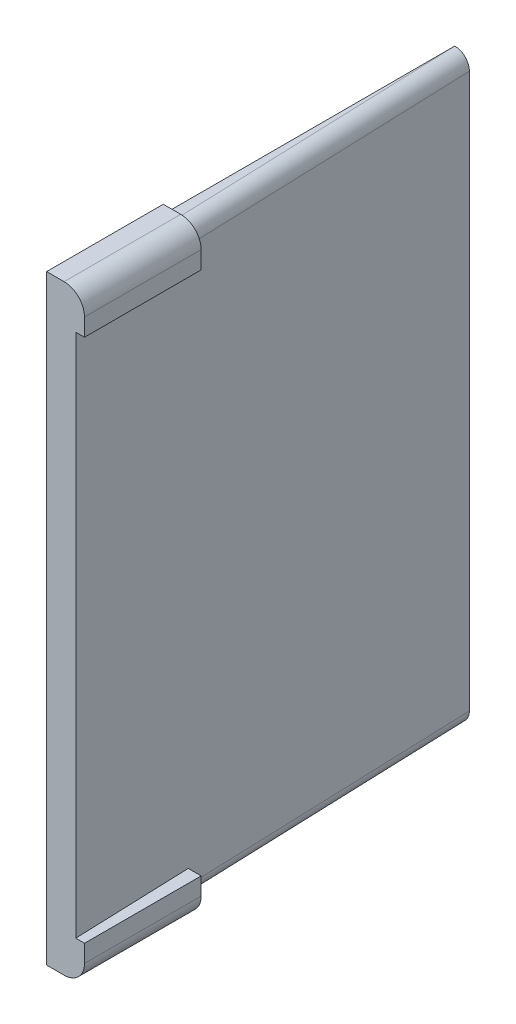
ISO-10303-21;
HEADER;
FILE_DESCRIPTION(('STEP AP214'),'2;1');
FILE_NAME('part.step','',(''),(''),'','','');
FILE_SCHEMA(('AUTOMOTIVE_DESIGN { 1 0 10303 214 1 1 1 1 }'));
ENDSEC;
DATA;
#1=APPLICATION_CONTEXT('core data for automotive mechanical design processes');
#2=APPLICATION_PROTOCOL_DEFINITION('international standard','automotive_design',2000,#1);
#3=PRODUCT_CONTEXT('',#1,'mechanical');
#4=PRODUCT('Part','Part','',(#3));
#5=PRODUCT_RELATED_PRODUCT_CATEGORY('part','',(#4));
#6=PRODUCT_DEFINITION_FORMATION('','',#4);
#7=PRODUCT_DEFINITION_CONTEXT('part definition',#1,'design');
#8=PRODUCT_DEFINITION('design','',#6,#7);
#9=PRODUCT_DEFINITION_SHAPE('','',#8);
#10=(LENGTH_UNIT() NAMED_UNIT(*) SI_UNIT(.MILLI.,.METRE.));
#11=(NAMED_UNIT(*) PLANE_ANGLE_UNIT() SI_UNIT($,.RADIAN.));
#12=(NAMED_UNIT(*) SI_UNIT($,.STERADIAN.) SOLID_ANGLE_UNIT());
#13=UNCERTAINTY_MEASURE_WITH_UNIT(LENGTH_MEASURE(1.E-05),#10,'distance_accuracy_value','');
#14=(GEOMETRIC_REPRESENTATION_CONTEXT(3) GLOBAL_UNCERTAINTY_ASSIGNED_CONTEXT((#13)) GLOBAL_UNIT_ASSIGNED_CONTEXT((#10,
#11,#12)) REPRESENTATION_CONTEXT('',''));
#15=CARTESIAN_POINT('',(0.,0.,0.));
#16=DIRECTION('',(0.,0.,1.));
#17=DIRECTION('',(1.,0.,0.));
#18=AXIS2_PLACEMENT_3D('',#15,#16,#17);
#19=CARTESIAN_POINT('',(0.,200.,0.));
#20=DIRECTION('',(1.,0.,0.));
#21=DIRECTION('',(0.,0.,-1.));
#22=AXIS2_PLACEMENT_3D('',#19,#20,#21);
#23=PLANE('',#22);
#24=DIRECTION('',(0.,0.,1.));
#25=VECTOR('',#24,1.);
#26=CARTESIAN_POINT('',(0.,0.,0.));
#27=LINE('',#26,#25);
#28=CARTESIAN_POINT('',(0.,0.,-140.));
#29=VERTEX_POINT('',#28);
#30=CARTESIAN_POINT('',(0.,0.,-139.910742738781));
#31=VERTEX_POINT('',#30);
#32=EDGE_CURVE('E250',#29,#31,#27,.T.);
#33=ORIENTED_EDGE('',*,*,#32,.T.);
#34=CARTESIAN_POINT('',(0.,0.,-40.));
#35=VERTEX_POINT('',#34);
#36=EDGE_CURVE('E244',#31,#35,#27,.T.);
#37=ORIENTED_EDGE('',*,*,#36,.T.);
#38=DIRECTION('',(0.,-1.,0.));
#39=VECTOR('',#38,1.);
#40=CARTESIAN_POINT('',(0.,9.99999999999999,-40.));
#41=LINE('',#40,#39);
#42=CARTESIAN_POINT('',(0.,-2.99999999999999,-40.));
#43=VERTEX_POINT('',#42);
#44=EDGE_CURVE('E189',#35,#43,#41,.T.);
#45=ORIENTED_EDGE('',*,*,#44,.T.);
#46=DIRECTION('',(0.,0.,1.));
#47=VECTOR('',#46,1.);
#48=CARTESIAN_POINT('',(0.,-2.99999999999998,0.));
#49=LINE('',#48,#47);
#50=CARTESIAN_POINT('',(0.,-2.99999999999998,0.));
#51=VERTEX_POINT('',#50);
#52=EDGE_CURVE('E169',#43,#51,#49,.T.);
#53=ORIENTED_EDGE('',*,*,#52,.T.);
#54=DIRECTION('',(0.,-1.,0.));
#55=VECTOR('',#54,1.);
#56=CARTESIAN_POINT('',(0.,200.,0.));
#57=LINE('',#56,#55);
#58=CARTESIAN_POINT('',(0.,203.,0.));
#59=VERTEX_POINT('',#58);
#60=EDGE_CURVE('E264',#59,#51,#57,.T.);
#61=ORIENTED_EDGE('',*,*,#60,.F.);
#62=DIRECTION('',(0.,0.,-1.));
#63=VECTOR('',#62,1.);
#64=CARTESIAN_POINT('',(0.,203.,0.));
#65=LINE('',#64,#63);
#66=CARTESIAN_POINT('',(0.,203.,-40.));
#67=VERTEX_POINT('',#66);
#68=EDGE_CURVE('E208',#59,#67,#65,.T.);
#69=ORIENTED_EDGE('',*,*,#68,.T.);
#70=DIRECTION('',(0.,-1.,0.));
#71=VECTOR('',#70,1.);
#72=CARTESIAN_POINT('',(0.,190.,-40.));
#73=LINE('',#72,#71);
#74=CARTESIAN_POINT('',(0.,200.,-40.));
#75=VERTEX_POINT('',#74);
#76=EDGE_CURVE('E214',#67,#75,#73,.T.);
#77=ORIENTED_EDGE('',*,*,#76,.T.);
#78=DIRECTION('',(0.,0.,1.));
#79=VECTOR('',#78,1.);
#80=CARTESIAN_POINT('',(0.,200.,0.));
#81=LINE('',#80,#79);
#82=CARTESIAN_POINT('',(0.,200.,-139.910742738781));
#83=VERTEX_POINT('',#82);
#84=EDGE_CURVE('E249',#83,#75,#81,.T.);
#85=ORIENTED_EDGE('',*,*,#84,.F.);
#86=CARTESIAN_POINT('',(0.,200.,-140.));
#87=VERTEX_POINT('',#86);
#88=EDGE_CURVE('E245',#87,#83,#81,.T.);
#89=ORIENTED_EDGE('',*,*,#88,.F.);
#90=DIRECTION('',(0.,-1.,0.));
#91=VECTOR('',#90,1.);
#92=CARTESIAN_POINT('',(0.,200.,-140.));
#93=LINE('',#92,#91);
#94=EDGE_CURVE('E248',#87,#29,#93,.T.);
#95=ORIENTED_EDGE('',*,*,#94,.T.);
#96=EDGE_LOOP('',(#33,#37,#45,#53,#61,#69,#77,#85,#89,#95));
#97=FACE_BOUND('',#96,.T.);
#98=ADVANCED_FACE('F41',(#97),#23,.F.);
#99=CARTESIAN_POINT('',(10.,200.,0.));
#100=DIRECTION('',(0.,0.,-1.));
#101=DIRECTION('',(-1.,0.,0.));
#102=AXIS2_PLACEMENT_3D('',#99,#100,#101);
#103=PLANE('',#102);
#104=DIRECTION('',(-1.,0.,0.));
#105=VECTOR('',#104,1.);
#106=CARTESIAN_POINT('',(13.,-2.99999999999998,0.));
#107=LINE('',#106,#105);
#108=CARTESIAN_POINT('',(6.,-2.99999999999998,0.));
#109=VERTEX_POINT('',#108);
#110=EDGE_CURVE('E196',#109,#51,#107,.T.);
#111=ORIENTED_EDGE('',*,*,#110,.F.);
#112=CARTESIAN_POINT('',(6.,4.00000000000002,0.));
#113=DIRECTION('',(0.,0.,-1.));
#114=DIRECTION('',(-1.,0.,0.));
#115=AXIS2_PLACEMENT_3D('',#112,#113,#114);
#116=CIRCLE('',#115,7.);
#117=CARTESIAN_POINT('',(13.,4.00000000000002,0.));
#118=VERTEX_POINT('',#117);
#119=EDGE_CURVE('E163',#109,#118,#116,.F.);
#120=ORIENTED_EDGE('',*,*,#119,.T.);
#121=DIRECTION('',(0.,1.,0.));
#122=VECTOR('',#121,1.);
#123=CARTESIAN_POINT('',(13.,10.,0.));
#124=LINE('',#123,#122);
#125=CARTESIAN_POINT('',(13.,10.,0.));
#126=VERTEX_POINT('',#125);
#127=EDGE_CURVE('E156',#118,#126,#124,.T.);
#128=ORIENTED_EDGE('',*,*,#127,.T.);
#129=DIRECTION('',(-1.,0.,0.));
#130=VECTOR('',#129,1.);
#131=CARTESIAN_POINT('',(13.,10.,0.));
#132=LINE('',#131,#130);
#133=CARTESIAN_POINT('',(10.,9.99999999999999,0.));
#134=VERTEX_POINT('',#133);
#135=EDGE_CURVE('E161',#126,#134,#132,.T.);
#136=ORIENTED_EDGE('',*,*,#135,.T.);
#137=DIRECTION('',(0.,-1.,0.));
#138=VECTOR('',#137,1.);
#139=CARTESIAN_POINT('',(10.,200.,0.));
#140=LINE('',#139,#138);
#141=CARTESIAN_POINT('',(10.,190.,0.));
#142=VERTEX_POINT('',#141);
#143=EDGE_CURVE('E261',#142,#134,#140,.T.);
#144=ORIENTED_EDGE('',*,*,#143,.F.);
#145=DIRECTION('',(-1.,0.,0.));
#146=VECTOR('',#145,1.);
#147=CARTESIAN_POINT('',(13.,190.,0.));
#148=LINE('',#147,#146);
#149=CARTESIAN_POINT('',(13.,190.,0.));
#150=VERTEX_POINT('',#149);
#151=EDGE_CURVE('E228',#150,#142,#148,.T.);
#152=ORIENTED_EDGE('',*,*,#151,.F.);
#153=DIRECTION('',(0.,1.,0.));
#154=VECTOR('',#153,1.);
#155=CARTESIAN_POINT('',(13.,190.,0.));
#156=LINE('',#155,#154);
#157=CARTESIAN_POINT('',(13.,196.,0.));
#158=VERTEX_POINT('',#157);
#159=EDGE_CURVE('E209',#150,#158,#156,.T.);
#160=ORIENTED_EDGE('',*,*,#159,.T.);
#161=CARTESIAN_POINT('',(6.,196.,0.));
#162=DIRECTION('',(0.,0.,-1.));
#163=DIRECTION('',(-1.,0.,0.));
#164=AXIS2_PLACEMENT_3D('',#161,#162,#163);
#165=CIRCLE('',#164,7.);
#166=CARTESIAN_POINT('',(6.,203.,0.));
#167=VERTEX_POINT('',#166);
#168=EDGE_CURVE('E283',#158,#167,#165,.F.);
#169=ORIENTED_EDGE('',*,*,#168,.T.);
#170=DIRECTION('',(-1.,0.,0.));
#171=VECTOR('',#170,1.);
#172=CARTESIAN_POINT('',(13.,203.,0.));
#173=LINE('',#172,#171);
#174=EDGE_CURVE('E221',#167,#59,#173,.T.);
#175=ORIENTED_EDGE('',*,*,#174,.T.);
#176=ORIENTED_EDGE('',*,*,#60,.T.);
#177=EDGE_LOOP('',(#111,#120,#128,#136,#144,#152,#160,#169,#175,#176));
#178=FACE_BOUND('',#177,.T.);
#179=ADVANCED_FACE('F159',(#178),#103,.F.);
#180=CARTESIAN_POINT('',(5.,200.,-140.));
#181=DIRECTION('',(-0.99936285434755,0.,0.0356915305124125));
#182=DIRECTION('',(0.0356915305124125,0.,0.99936285434755));
#183=AXIS2_PLACEMENT_3D('',#180,#181,#182);
#184=PLANE('',#183);
#185=DIRECTION('',(0.,-1.,0.));
#186=VECTOR('',#185,1.);
#187=CARTESIAN_POINT('',(8.57142857142857,200.,-40.));
#188=LINE('',#187,#186);
#189=CARTESIAN_POINT('',(8.57142857142857,9.99999999999998,-40.));
#190=VERTEX_POINT('',#189);
#191=CARTESIAN_POINT('',(8.57142857142857,5.00000000000006,-40.));
#192=VERTEX_POINT('',#191);
#193=EDGE_CURVE('E199',#190,#192,#188,.T.);
#194=ORIENTED_EDGE('',*,*,#193,.T.);
#195=DIRECTION('',(-0.0356915305124125,0.,-0.99936285434755));
#196=VECTOR('',#195,1.);
#197=CARTESIAN_POINT('',(5.,5.,-140.));
#198=LINE('',#197,#196);
#199=CARTESIAN_POINT('',(5.,5.,-140.));
#200=VERTEX_POINT('',#199);
#201=EDGE_CURVE('E307',#192,#200,#198,.T.);
#202=ORIENTED_EDGE('',*,*,#201,.T.);
#203=DIRECTION('',(0.,-1.,0.));
#204=VECTOR('',#203,1.);
#205=CARTESIAN_POINT('',(5.,200.,-140.));
#206=LINE('',#205,#204);
#207=CARTESIAN_POINT('',(5.,195.,-140.));
#208=VERTEX_POINT('',#207);
#209=EDGE_CURVE('E257',#208,#200,#206,.T.);
#210=ORIENTED_EDGE('',*,*,#209,.F.);
#211=DIRECTION('',(-0.0356915305124125,0.,-0.99936285434755));
#212=VECTOR('',#211,1.);
#213=CARTESIAN_POINT('',(5.,195.,-140.));
#214=LINE('',#213,#212);
#215=CARTESIAN_POINT('',(8.57142857142857,195.,-40.));
#216=VERTEX_POINT('',#215);
#217=EDGE_CURVE('E304',#208,#216,#214,.F.);
#218=ORIENTED_EDGE('',*,*,#217,.T.);
#219=DIRECTION('',(0.,-1.,0.));
#220=VECTOR('',#219,1.);
#221=CARTESIAN_POINT('',(8.57142857142857,200.,-40.));
#222=LINE('',#221,#220);
#223=CARTESIAN_POINT('',(8.57142857142857,190.,-40.));
#224=VERTEX_POINT('',#223);
#225=EDGE_CURVE('E232',#216,#224,#222,.T.);
#226=ORIENTED_EDGE('',*,*,#225,.T.);
#227=DIRECTION('',(0.0356915305124125,0.,0.99936285434755));
#228=VECTOR('',#227,1.);
#229=CARTESIAN_POINT('',(5.,190.,-140.));
#230=LINE('',#229,#228);
#231=EDGE_CURVE('E271',#224,#142,#230,.T.);
#232=ORIENTED_EDGE('',*,*,#231,.T.);
#233=ORIENTED_EDGE('',*,*,#143,.T.);
#234=DIRECTION('',(-0.0356915305124125,0.,-0.99936285434755));
#235=VECTOR('',#234,1.);
#236=CARTESIAN_POINT('',(5.,9.99999999999993,-140.));
#237=LINE('',#236,#235);
#238=EDGE_CURVE('E176',#134,#190,#237,.T.);
#239=ORIENTED_EDGE('',*,*,#238,.T.);
#240=EDGE_LOOP('',(#194,#202,#210,#218,#226,#232,#233,#239));
#241=FACE_BOUND('',#240,.T.);
#242=ADVANCED_FACE('F330',(#241),#184,.F.);
#243=CARTESIAN_POINT('',(0.,200.,-140.));
#244=DIRECTION('',(0.,0.,1.));
#245=DIRECTION('',(1.,0.,0.));
#246=AXIS2_PLACEMENT_3D('',#243,#244,#245);
#247=PLANE('',#246);
#248=ORIENTED_EDGE('',*,*,#209,.T.);
#249=CARTESIAN_POINT('',(-0.00318775932924914,5.,-140.));
#250=DIRECTION('',(0.,0.,1.));
#251=DIRECTION('',(1.,0.,0.));
#252=AXIS2_PLACEMENT_3D('',#249,#250,#251);
#253=ELLIPSE('',#252,5.00318775932925,5.);
#254=EDGE_CURVE('E314',#200,#29,#253,.F.);
#255=ORIENTED_EDGE('',*,*,#254,.T.);
#256=ORIENTED_EDGE('',*,*,#94,.F.);
#257=CARTESIAN_POINT('',(-0.00318775932924877,195.,-140.));
#258=DIRECTION('',(0.,0.,1.));
#259=DIRECTION('',(-1.,0.,0.));
#260=AXIS2_PLACEMENT_3D('',#257,#258,#259);
#261=ELLIPSE('',#260,5.00318775932925,5.);
#262=EDGE_CURVE('E311',#87,#208,#261,.F.);
#263=ORIENTED_EDGE('',*,*,#262,.T.);
#264=EDGE_LOOP('',(#248,#255,#256,#263));
#265=FACE_BOUND('',#264,.T.);
#266=ADVANCED_FACE('F335',(#265),#247,.F.);
#267=CARTESIAN_POINT('',(0.,200.,0.));
#268=DIRECTION('',(0.,-1.,0.));
#269=DIRECTION('',(0.,0.,-1.));
#270=AXIS2_PLACEMENT_3D('',#267,#268,#269);
#271=PLANE('',#270);
#272=DIRECTION('',(1.,0.,0.));
#273=VECTOR('',#272,1.);
#274=CARTESIAN_POINT('',(0.,200.,-40.));
#275=LINE('',#274,#273);
#276=CARTESIAN_POINT('',(3.56824081209932,200.,-40.));
#277=VERTEX_POINT('',#276);
#278=EDGE_CURVE('E268',#75,#277,#275,.T.);
#279=ORIENTED_EDGE('',*,*,#278,.T.);
#280=DIRECTION('',(-0.0356915305124125,0.,-0.99936285434755));
#281=VECTOR('',#280,1.);
#282=CARTESIAN_POINT('',(4.99044687475907,200.,-0.17823024552711));
#283=LINE('',#282,#281);
#284=EDGE_CURVE('E319',#277,#83,#283,.T.);
#285=ORIENTED_EDGE('',*,*,#284,.T.);
#286=ORIENTED_EDGE('',*,*,#84,.T.);
#287=EDGE_LOOP('',(#279,#285,#286));
#288=FACE_BOUND('',#287,.T.);
#289=ADVANCED_FACE('F348',(#288),#271,.F.);
#290=CARTESIAN_POINT('',(0.,0.,0.));
#291=DIRECTION('',(0.,-1.,0.));
#292=DIRECTION('',(0.,0.,-1.));
#293=AXIS2_PLACEMENT_3D('',#290,#291,#292);
#294=PLANE('',#293);
#295=ORIENTED_EDGE('',*,*,#36,.F.);
#296=DIRECTION('',(-0.0356915305124125,0.,-0.99936285434755));
#297=VECTOR('',#296,1.);
#298=CARTESIAN_POINT('',(3.57461429969083,0.,-39.8215423474379));
#299=LINE('',#298,#297);
#300=CARTESIAN_POINT('',(3.56824081209932,0.,-40.));
#301=VERTEX_POINT('',#300);
#302=EDGE_CURVE('E63',#31,#301,#299,.F.);
#303=ORIENTED_EDGE('',*,*,#302,.T.);
#304=DIRECTION('',(1.,0.,0.));
#305=VECTOR('',#304,1.);
#306=CARTESIAN_POINT('',(0.,0.,-40.));
#307=LINE('',#306,#305);
#308=EDGE_CURVE('E274',#35,#301,#307,.T.);
#309=ORIENTED_EDGE('',*,*,#308,.F.);
#310=EDGE_LOOP('',(#295,#303,#309));
#311=FACE_BOUND('',#310,.T.);
#312=ADVANCED_FACE('F368',(#311),#294,.T.);
#313=CARTESIAN_POINT('',(13.,190.,0.));
#314=DIRECTION('',(0.,-1.,0.));
#315=DIRECTION('',(0.,0.,-1.));
#316=AXIS2_PLACEMENT_3D('',#313,#314,#315);
#317=PLANE('',#316);
#318=ORIENTED_EDGE('',*,*,#231,.F.);
#319=DIRECTION('',(-1.,0.,0.));
#320=VECTOR('',#319,1.);
#321=CARTESIAN_POINT('',(13.,190.,-40.));
#322=LINE('',#321,#320);
#323=CARTESIAN_POINT('',(13.,190.,-40.));
#324=VERTEX_POINT('',#323);
#325=EDGE_CURVE('E233',#324,#224,#322,.T.);
#326=ORIENTED_EDGE('',*,*,#325,.F.);
#327=DIRECTION('',(0.,0.,1.));
#328=VECTOR('',#327,1.);
#329=CARTESIAN_POINT('',(13.,190.,0.));
#330=LINE('',#329,#328);
#331=EDGE_CURVE('E217',#324,#150,#330,.T.);
#332=ORIENTED_EDGE('',*,*,#331,.T.);
#333=ORIENTED_EDGE('',*,*,#151,.T.);
#334=EDGE_LOOP('',(#318,#326,#332,#333));
#335=FACE_BOUND('',#334,.T.);
#336=ADVANCED_FACE('F366',(#335),#317,.T.);
#337=CARTESIAN_POINT('',(13.,190.,-40.));
#338=DIRECTION('',(0.,0.,-1.));
#339=DIRECTION('',(-1.,0.,0.));
#340=AXIS2_PLACEMENT_3D('',#337,#338,#339);
#341=PLANE('',#340);
#342=DIRECTION('',(-1.,0.,0.));
#343=VECTOR('',#342,1.);
#344=CARTESIAN_POINT('',(13.,203.,-40.));
#345=LINE('',#344,#343);
#346=CARTESIAN_POINT('',(6.,203.,-40.));
#347=VERTEX_POINT('',#346);
#348=EDGE_CURVE('E237',#347,#67,#345,.T.);
#349=ORIENTED_EDGE('',*,*,#348,.F.);
#350=CARTESIAN_POINT('',(6.,196.,-40.));
#351=DIRECTION('',(0.,0.,-1.));
#352=DIRECTION('',(-1.,0.,0.));
#353=AXIS2_PLACEMENT_3D('',#350,#351,#352);
#354=CIRCLE('',#353,7.);
#355=CARTESIAN_POINT('',(13.,196.,-40.));
#356=VERTEX_POINT('',#355);
#357=EDGE_CURVE('E298',#347,#356,#354,.T.);
#358=ORIENTED_EDGE('',*,*,#357,.T.);
#359=DIRECTION('',(0.,-1.,0.));
#360=VECTOR('',#359,1.);
#361=CARTESIAN_POINT('',(13.,190.,-40.));
#362=LINE('',#361,#360);
#363=EDGE_CURVE('E213',#356,#324,#362,.T.);
#364=ORIENTED_EDGE('',*,*,#363,.T.);
#365=ORIENTED_EDGE('',*,*,#325,.T.);
#366=ORIENTED_EDGE('',*,*,#225,.F.);
#367=CARTESIAN_POINT('',(3.56824081209932,195.,-40.));
#368=DIRECTION('',(0.,0.,-1.));
#369=DIRECTION('',(-1.,0.,0.));
#370=AXIS2_PLACEMENT_3D('',#367,#368,#369);
#371=ELLIPSE('',#370,5.00318775932925,5.);
#372=EDGE_CURVE('E11',#216,#277,#371,.F.);
#373=ORIENTED_EDGE('',*,*,#372,.T.);
#374=ORIENTED_EDGE('',*,*,#278,.F.);
#375=ORIENTED_EDGE('',*,*,#76,.F.);
#376=EDGE_LOOP('',(#349,#358,#364,#365,#366,#373,#374,#375));
#377=FACE_BOUND('',#376,.T.);
#378=ADVANCED_FACE('F345',(#377),#341,.T.);
#379=CARTESIAN_POINT('',(13.,203.,0.));
#380=DIRECTION('',(0.,1.,0.));
#381=DIRECTION('',(0.,0.,1.));
#382=AXIS2_PLACEMENT_3D('',#379,#380,#381);
#383=PLANE('',#382);
#384=ORIENTED_EDGE('',*,*,#174,.F.);
#385=DIRECTION('',(0.,0.,-1.));
#386=VECTOR('',#385,1.);
#387=CARTESIAN_POINT('',(6.,203.,-40.));
#388=LINE('',#387,#386);
#389=EDGE_CURVE('E294',#167,#347,#388,.T.);
#390=ORIENTED_EDGE('',*,*,#389,.T.);
#391=ORIENTED_EDGE('',*,*,#348,.T.);
#392=ORIENTED_EDGE('',*,*,#68,.F.);
#393=EDGE_LOOP('',(#384,#390,#391,#392));
#394=FACE_BOUND('',#393,.T.);
#395=ADVANCED_FACE('F354',(#394),#383,.T.);
#396=CARTESIAN_POINT('',(13.,0.,0.));
#397=DIRECTION('',(-1.,0.,0.));
#398=DIRECTION('',(0.,0.,1.));
#399=AXIS2_PLACEMENT_3D('',#396,#397,#398);
#400=PLANE('',#399);
#401=ORIENTED_EDGE('',*,*,#363,.F.);
#402=DIRECTION('',(0.,0.,-1.));
#403=VECTOR('',#402,1.);
#404=CARTESIAN_POINT('',(13.,196.,0.));
#405=LINE('',#404,#403);
#406=EDGE_CURVE('E301',#356,#158,#405,.F.);
#407=ORIENTED_EDGE('',*,*,#406,.T.);
#408=ORIENTED_EDGE('',*,*,#159,.F.);
#409=ORIENTED_EDGE('',*,*,#331,.F.);
#410=EDGE_LOOP('',(#401,#407,#408,#409));
#411=FACE_BOUND('',#410,.T.);
#412=ADVANCED_FACE('F361',(#411),#400,.F.);
#413=CARTESIAN_POINT('',(13.,10.,0.));
#414=DIRECTION('',(0.,1.,0.));
#415=DIRECTION('',(0.,0.,1.));
#416=AXIS2_PLACEMENT_3D('',#413,#414,#415);
#417=PLANE('',#416);
#418=ORIENTED_EDGE('',*,*,#238,.F.);
#419=ORIENTED_EDGE('',*,*,#135,.F.);
#420=DIRECTION('',(0.,0.,-1.));
#421=VECTOR('',#420,1.);
#422=CARTESIAN_POINT('',(13.,10.,0.));
#423=LINE('',#422,#421);
#424=CARTESIAN_POINT('',(13.,9.99999999999999,-40.));
#425=VERTEX_POINT('',#424);
#426=EDGE_CURVE('E168',#126,#425,#423,.T.);
#427=ORIENTED_EDGE('',*,*,#426,.T.);
#428=DIRECTION('',(-1.,0.,0.));
#429=VECTOR('',#428,1.);
#430=CARTESIAN_POINT('',(13.,9.99999999999999,-40.));
#431=LINE('',#430,#429);
#432=EDGE_CURVE('E178',#425,#190,#431,.T.);
#433=ORIENTED_EDGE('',*,*,#432,.T.);
#434=EDGE_LOOP('',(#418,#419,#427,#433));
#435=FACE_BOUND('',#434,.T.);
#436=ADVANCED_FACE('F173',(#435),#417,.T.);
#437=CARTESIAN_POINT('',(13.,9.99999999999999,-40.));
#438=DIRECTION('',(0.,0.,-1.));
#439=DIRECTION('',(-1.,0.,0.));
#440=AXIS2_PLACEMENT_3D('',#437,#438,#439);
#441=PLANE('',#440);
#442=DIRECTION('',(0.,-1.,0.));
#443=VECTOR('',#442,1.);
#444=CARTESIAN_POINT('',(13.,9.99999999999999,-40.));
#445=LINE('',#444,#443);
#446=CARTESIAN_POINT('',(13.,4.00000000000001,-40.));
#447=VERTEX_POINT('',#446);
#448=EDGE_CURVE('E179',#425,#447,#445,.T.);
#449=ORIENTED_EDGE('',*,*,#448,.T.);
#450=CARTESIAN_POINT('',(6.,4.00000000000001,-40.));
#451=DIRECTION('',(0.,0.,-1.));
#452=DIRECTION('',(-1.,0.,0.));
#453=AXIS2_PLACEMENT_3D('',#450,#451,#452);
#454=CIRCLE('',#453,7.);
#455=CARTESIAN_POINT('',(6.,-2.99999999999999,-40.));
#456=VERTEX_POINT('',#455);
#457=EDGE_CURVE('E291',#447,#456,#454,.T.);
#458=ORIENTED_EDGE('',*,*,#457,.T.);
#459=DIRECTION('',(-1.,0.,0.));
#460=VECTOR('',#459,1.);
#461=CARTESIAN_POINT('',(13.,-2.99999999999999,-40.));
#462=LINE('',#461,#460);
#463=EDGE_CURVE('E200',#456,#43,#462,.T.);
#464=ORIENTED_EDGE('',*,*,#463,.T.);
#465=ORIENTED_EDGE('',*,*,#44,.F.);
#466=ORIENTED_EDGE('',*,*,#308,.T.);
#467=CARTESIAN_POINT('',(3.56824081209932,5.,-40.));
#468=DIRECTION('',(0.,0.,-1.));
#469=DIRECTION('',(1.,0.,0.));
#470=AXIS2_PLACEMENT_3D('',#467,#468,#469);
#471=ELLIPSE('',#470,5.00318775932925,5.);
#472=EDGE_CURVE('E50',#301,#192,#471,.F.);
#473=ORIENTED_EDGE('',*,*,#472,.T.);
#474=ORIENTED_EDGE('',*,*,#193,.F.);
#475=ORIENTED_EDGE('',*,*,#432,.F.);
#476=EDGE_LOOP('',(#449,#458,#464,#465,#466,#473,#474,#475));
#477=FACE_BOUND('',#476,.T.);
#478=ADVANCED_FACE('F325',(#477),#441,.T.);
#479=CARTESIAN_POINT('',(13.,-2.99999999999998,0.));
#480=DIRECTION('',(0.,-1.,0.));
#481=DIRECTION('',(0.,0.,-1.));
#482=AXIS2_PLACEMENT_3D('',#479,#480,#481);
#483=PLANE('',#482);
#484=ORIENTED_EDGE('',*,*,#463,.F.);
#485=DIRECTION('',(0.,0.,1.));
#486=VECTOR('',#485,1.);
#487=CARTESIAN_POINT('',(6.,-2.99999999999998,0.));
#488=LINE('',#487,#486);
#489=EDGE_CURVE('E279',#456,#109,#488,.T.);
#490=ORIENTED_EDGE('',*,*,#489,.T.);
#491=ORIENTED_EDGE('',*,*,#110,.T.);
#492=ORIENTED_EDGE('',*,*,#52,.F.);
#493=EDGE_LOOP('',(#484,#490,#491,#492));
#494=FACE_BOUND('',#493,.T.);
#495=ADVANCED_FACE('F411',(#494),#483,.T.);
#496=CARTESIAN_POINT('',(13.,0.,0.));
#497=DIRECTION('',(1.,0.,0.));
#498=DIRECTION('',(0.,0.,-1.));
#499=AXIS2_PLACEMENT_3D('',#496,#497,#498);
#500=PLANE('',#499);
#501=ORIENTED_EDGE('',*,*,#127,.F.);
#502=DIRECTION('',(0.,0.,1.));
#503=VECTOR('',#502,1.);
#504=CARTESIAN_POINT('',(13.,4.00000000000002,0.));
#505=LINE('',#504,#503);
#506=EDGE_CURVE('E288',#118,#447,#505,.F.);
#507=ORIENTED_EDGE('',*,*,#506,.T.);
#508=ORIENTED_EDGE('',*,*,#448,.F.);
#509=ORIENTED_EDGE('',*,*,#426,.F.);
#510=EDGE_LOOP('',(#501,#507,#508,#509));
#511=FACE_BOUND('',#510,.T.);
#512=ADVANCED_FACE('F182',(#511),#500,.T.);
#513=CARTESIAN_POINT('',(6.,4.00000000000002,0.));
#514=DIRECTION('',(0.,0.,1.));
#515=DIRECTION('',(0.,-1.,0.));
#516=AXIS2_PLACEMENT_3D('',#513,#514,#515);
#517=CYLINDRICAL_SURFACE('',#516,7.);
#518=ORIENTED_EDGE('',*,*,#457,.F.);
#519=ORIENTED_EDGE('',*,*,#506,.F.);
#520=ORIENTED_EDGE('',*,*,#119,.F.);
#521=ORIENTED_EDGE('',*,*,#489,.F.);
#522=EDGE_LOOP('',(#518,#519,#520,#521));
#523=FACE_BOUND('',#522,.T.);
#524=ADVANCED_FACE('F385',(#523),#517,.T.);
#525=CARTESIAN_POINT('',(6.,196.,0.));
#526=DIRECTION('',(0.,0.,1.));
#527=DIRECTION('',(1.,0.,0.));
#528=AXIS2_PLACEMENT_3D('',#525,#526,#527);
#529=CYLINDRICAL_SURFACE('',#528,7.);
#530=ORIENTED_EDGE('',*,*,#168,.F.);
#531=ORIENTED_EDGE('',*,*,#406,.F.);
#532=ORIENTED_EDGE('',*,*,#357,.F.);
#533=ORIENTED_EDGE('',*,*,#389,.F.);
#534=EDGE_LOOP('',(#530,#531,#532,#533));
#535=FACE_BOUND('',#534,.T.);
#536=ADVANCED_FACE('F364',(#535),#529,.T.);
#537=CARTESIAN_POINT('',(0.00318572826225275,5.,-139.821542347438));
#538=DIRECTION('',(0.0356915305124125,0.,0.99936285434755));
#539=DIRECTION('',(0.99936285434755,0.,-0.0356915305124125));
#540=AXIS2_PLACEMENT_3D('',#537,#538,#539);
#541=CYLINDRICAL_SURFACE('',#540,5.);
#542=ORIENTED_EDGE('',*,*,#472,.F.);
#543=ORIENTED_EDGE('',*,*,#302,.F.);
#544=ORIENTED_EDGE('',*,*,#32,.F.);
#545=ORIENTED_EDGE('',*,*,#254,.F.);
#546=ORIENTED_EDGE('',*,*,#201,.F.);
#547=EDGE_LOOP('',(#542,#543,#544,#545,#546));
#548=FACE_BOUND('',#547,.T.);
#549=ADVANCED_FACE('F332',(#548),#541,.T.);
#550=CARTESIAN_POINT('',(4.99044687475907,195.,-0.17823024552711));
#551=DIRECTION('',(-0.0356915305124125,0.,-0.99936285434755));
#552=DIRECTION('',(-0.99936285434755,0.,0.0356915305124125));
#553=AXIS2_PLACEMENT_3D('',#550,#551,#552);
#554=CYLINDRICAL_SURFACE('',#553,5.);
#555=ORIENTED_EDGE('',*,*,#372,.F.);
#556=ORIENTED_EDGE('',*,*,#217,.F.);
#557=ORIENTED_EDGE('',*,*,#262,.F.);
#558=ORIENTED_EDGE('',*,*,#88,.T.);
#559=ORIENTED_EDGE('',*,*,#284,.F.);
#560=EDGE_LOOP('',(#555,#556,#557,#558,#559));
#561=FACE_BOUND('',#560,.T.);
#562=ADVANCED_FACE('F43',(#561),#554,.T.);
#563=CLOSED_SHELL('',(#98,#179,#242,#266,#289,#312,#336,#378,#395,#412,#436,#478,#495,#512,#524,
#536,#549,#562));
#564=MANIFOLD_SOLID_BREP('B2',#563);
#565=ADVANCED_BREP_SHAPE_REPRESENTATION('',(#18,#564),#14);
#566=SHAPE_DEFINITION_REPRESENTATION(#9,#565);
ENDSEC;
END-ISO-10303-21;
